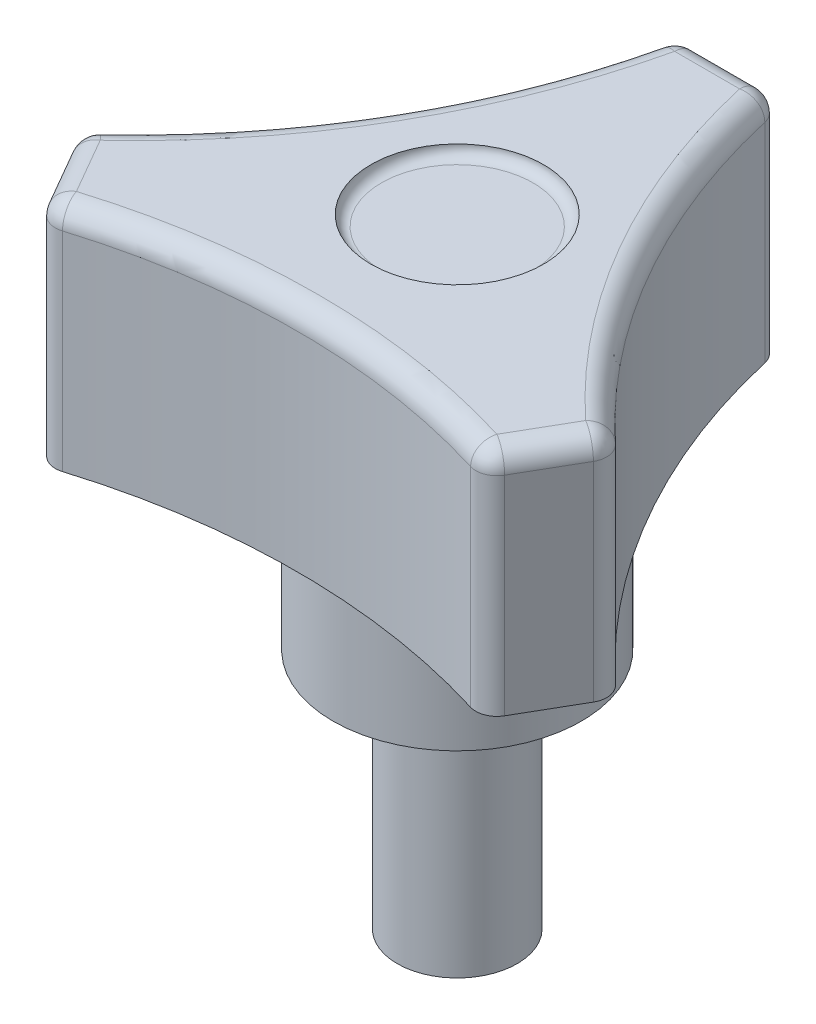
ISO-10303-21;
HEADER;
FILE_DESCRIPTION(('STEP AP214'),'2;1');
FILE_NAME('part.step','',(''),(''),'','','');
FILE_SCHEMA(('AUTOMOTIVE_DESIGN { 1 0 10303 214 1 1 1 1 }'));
ENDSEC;
DATA;
#1=APPLICATION_CONTEXT('core data for automotive mechanical design processes');
#2=APPLICATION_PROTOCOL_DEFINITION('international standard','automotive_design',2000,#1);
#3=PRODUCT_CONTEXT('',#1,'mechanical');
#4=PRODUCT('Part','Part','',(#3));
#5=PRODUCT_RELATED_PRODUCT_CATEGORY('part','',(#4));
#6=PRODUCT_DEFINITION_FORMATION('','',#4);
#7=PRODUCT_DEFINITION_CONTEXT('part definition',#1,'design');
#8=PRODUCT_DEFINITION('design','',#6,#7);
#9=PRODUCT_DEFINITION_SHAPE('','',#8);
#10=(LENGTH_UNIT() NAMED_UNIT(*) SI_UNIT(.MILLI.,.METRE.));
#11=(NAMED_UNIT(*) PLANE_ANGLE_UNIT() SI_UNIT($,.RADIAN.));
#12=(NAMED_UNIT(*) SI_UNIT($,.STERADIAN.) SOLID_ANGLE_UNIT());
#13=UNCERTAINTY_MEASURE_WITH_UNIT(LENGTH_MEASURE(1.E-05),#10,'distance_accuracy_value','');
#14=(GEOMETRIC_REPRESENTATION_CONTEXT(3) GLOBAL_UNCERTAINTY_ASSIGNED_CONTEXT((#13)) GLOBAL_UNIT_ASSIGNED_CONTEXT((#10,
#11,#12)) REPRESENTATION_CONTEXT('',''));
#15=CARTESIAN_POINT('',(0.,0.,0.));
#16=DIRECTION('',(0.,0.,1.));
#17=DIRECTION('',(1.,0.,0.));
#18=AXIS2_PLACEMENT_3D('',#15,#16,#17);
#19=CARTESIAN_POINT('',(0.,18.5,0.));
#20=DIRECTION('',(0.,-1.,0.));
#21=DIRECTION('',(0.,0.,-1.));
#22=AXIS2_PLACEMENT_3D('',#19,#20,#21);
#23=CYLINDRICAL_SURFACE('',#22,5.9);
#24=CARTESIAN_POINT('',(0.,18.5,0.));
#25=DIRECTION('',(0.,1.,0.));
#26=DIRECTION('',(0.,0.,1.));
#27=AXIS2_PLACEMENT_3D('',#24,#25,#26);
#28=CIRCLE('',#27,5.9);
#29=CARTESIAN_POINT('',(0.,18.5,5.9));
#30=VERTEX_POINT('',#29);
#31=EDGE_CURVE('E200',#30,#30,#28,.T.);
#32=ORIENTED_EDGE('',*,*,#31,.F.);
#33=EDGE_LOOP('',(#32));
#34=FACE_BOUND('',#33,.T.);
#35=CARTESIAN_POINT('',(0.,11.5,0.));
#36=DIRECTION('',(0.,1.,0.));
#37=DIRECTION('',(0.,0.,1.));
#38=AXIS2_PLACEMENT_3D('',#35,#36,#37);
#39=CIRCLE('',#38,5.9);
#40=CARTESIAN_POINT('',(0.,11.5,5.9));
#41=VERTEX_POINT('',#40);
#42=EDGE_CURVE('E199',#41,#41,#39,.T.);
#43=ORIENTED_EDGE('',*,*,#42,.T.);
#44=EDGE_LOOP('',(#43));
#45=FACE_BOUND('',#44,.T.);
#46=ADVANCED_FACE('F51',(#34,#45),#23,.T.);
#47=CARTESIAN_POINT('',(0.,11.5,0.));
#48=DIRECTION('',(0.,1.,0.));
#49=DIRECTION('',(0.,0.,1.));
#50=AXIS2_PLACEMENT_3D('',#47,#48,#49);
#51=PLANE('',#50);
#52=ORIENTED_EDGE('',*,*,#42,.F.);
#53=EDGE_LOOP('',(#52));
#54=FACE_BOUND('',#53,.T.);
#55=ADVANCED_FACE('F403',(#54),#51,.F.);
#56=CARTESIAN_POINT('',(0.,29.4,40.5683823529415));
#57=DIRECTION('',(0.,-1.,0.));
#58=DIRECTION('',(0.,0.,-1.));
#59=AXIS2_PLACEMENT_3D('',#56,#57,#58);
#60=CYLINDRICAL_SURFACE('',#59,32.9683823529415);
#61=CARTESIAN_POINT('',(0.,28.4,40.5683823529415));
#62=DIRECTION('',(0.,-1.,0.));
#63=DIRECTION('',(0.,0.,-1.));
#64=AXIS2_PLACEMENT_3D('',#61,#62,#63);
#65=CIRCLE('',#64,32.9683823529415);
#66=CARTESIAN_POINT('',(9.69329117239259,28.4,9.05720431693403));
#67=VERTEX_POINT('',#66);
#68=CARTESIAN_POINT('',(-9.69329117239258,28.4,9.05720431693404));
#69=VERTEX_POINT('',#68);
#70=EDGE_CURVE('E66',#67,#69,#65,.F.);
#71=ORIENTED_EDGE('',*,*,#70,.T.);
#72=DIRECTION('',(0.,-1.,0.));
#73=VECTOR('',#72,1.);
#74=CARTESIAN_POINT('',(-9.69329117239258,29.4,9.05720431693403));
#75=LINE('',#74,#73);
#76=CARTESIAN_POINT('',(-9.69329117239258,18.5,9.05720431693404));
#77=VERTEX_POINT('',#76);
#78=EDGE_CURVE('E59',#69,#77,#75,.T.);
#79=ORIENTED_EDGE('',*,*,#78,.T.);
#80=CARTESIAN_POINT('',(0.,18.5,40.5683823529415));
#81=DIRECTION('',(0.,-1.,0.));
#82=DIRECTION('',(0.,0.,-1.));
#83=AXIS2_PLACEMENT_3D('',#80,#81,#82);
#84=CIRCLE('',#83,32.9683823529415);
#85=CARTESIAN_POINT('',(9.69329117239259,18.5,9.05720431693403));
#86=VERTEX_POINT('',#85);
#87=EDGE_CURVE('E190',#77,#86,#84,.T.);
#88=ORIENTED_EDGE('',*,*,#87,.T.);
#89=DIRECTION('',(0.,-1.,0.));
#90=VECTOR('',#89,1.);
#91=CARTESIAN_POINT('',(9.69329117239259,29.4,9.05720431693403));
#92=LINE('',#91,#90);
#93=EDGE_CURVE('E71',#86,#67,#92,.F.);
#94=ORIENTED_EDGE('',*,*,#93,.T.);
#95=EDGE_LOOP('',(#71,#79,#88,#94));
#96=FACE_BOUND('',#95,.T.);
#97=ADVANCED_FACE('F364',(#96),#60,.F.);
#98=CARTESIAN_POINT('',(10.45,29.4,9.3));
#99=DIRECTION('',(-0.866025403784442,0.,-0.499999999999995));
#100=DIRECTION('',(-0.499999999999995,0.,0.866025403784442));
#101=AXIS2_PLACEMENT_3D('',#98,#99,#100);
#102=PLANE('',#101);
#103=DIRECTION('',(0.499999999999995,0.,-0.866025403784442));
#104=VECTOR('',#103,1.);
#105=CARTESIAN_POINT('',(10.45,18.5,9.3));
#106=LINE('',#105,#104);
#107=CARTESIAN_POINT('',(10.8533343738543,18.5,8.60140437204544));
#108=VERTEX_POINT('',#107);
#109=CARTESIAN_POINT('',(12.3966656261457,18.5,5.9282762301677));
#110=VERTEX_POINT('',#109);
#111=EDGE_CURVE('E185',#108,#110,#106,.T.);
#112=ORIENTED_EDGE('',*,*,#111,.T.);
#113=DIRECTION('',(0.,-1.,0.));
#114=VECTOR('',#113,1.);
#115=CARTESIAN_POINT('',(12.3966656261457,29.4,5.9282762301677));
#116=LINE('',#115,#114);
#117=CARTESIAN_POINT('',(12.3966656261457,28.4,5.9282762301677));
#118=VERTEX_POINT('',#117);
#119=EDGE_CURVE('E162',#110,#118,#116,.F.);
#120=ORIENTED_EDGE('',*,*,#119,.T.);
#121=DIRECTION('',(0.499999999999995,0.,-0.866025403784442));
#122=VECTOR('',#121,1.);
#123=CARTESIAN_POINT('',(10.45,28.4,9.3));
#124=LINE('',#123,#122);
#125=CARTESIAN_POINT('',(10.8533343738543,28.4,8.60140437204544));
#126=VERTEX_POINT('',#125);
#127=EDGE_CURVE('E167',#118,#126,#124,.F.);
#128=ORIENTED_EDGE('',*,*,#127,.T.);
#129=DIRECTION('',(0.,-1.,0.));
#130=VECTOR('',#129,1.);
#131=CARTESIAN_POINT('',(10.8533343738543,29.4,8.60140437204544));
#132=LINE('',#131,#130);
#133=EDGE_CURVE('E216',#126,#108,#132,.T.);
#134=ORIENTED_EDGE('',*,*,#133,.T.);
#135=EDGE_LOOP('',(#112,#120,#128,#134));
#136=FACE_BOUND('',#135,.T.);
#137=ADVANCED_FACE('F344',(#136),#102,.F.);
#138=CARTESIAN_POINT('',(34.6542134528919,29.4,-19.4544760438048));
#139=DIRECTION('',(0.,-1.,0.));
#140=DIRECTION('',(0.,0.,-1.));
#141=AXIS2_PLACEMENT_3D('',#138,#139,#140);
#142=CYLINDRICAL_SURFACE('',#141,32.9683823529411);
#143=CARTESIAN_POINT('',(34.6542134528919,28.4,-19.4544760438048));
#144=DIRECTION('',(0.,-1.,0.));
#145=DIRECTION('',(0.,0.,-1.));
#146=AXIS2_PLACEMENT_3D('',#143,#144,#145);
#147=CIRCLE('',#146,32.9683823529411);
#148=CARTESIAN_POINT('',(2.51808718433934,28.4,-12.0935234273726));
#149=VERTEX_POINT('',#148);
#150=CARTESIAN_POINT('',(12.2113783567319,28.4,4.69574937577017));
#151=VERTEX_POINT('',#150);
#152=EDGE_CURVE('E176',#149,#151,#147,.F.);
#153=ORIENTED_EDGE('',*,*,#152,.T.);
#154=DIRECTION('',(0.,-1.,0.));
#155=VECTOR('',#154,1.);
#156=CARTESIAN_POINT('',(12.2113783567319,29.4,4.69574937577017));
#157=LINE('',#156,#155);
#158=CARTESIAN_POINT('',(12.2113783567319,18.5,4.69574937577017));
#159=VERTEX_POINT('',#158);
#160=EDGE_CURVE('E161',#151,#159,#157,.T.);
#161=ORIENTED_EDGE('',*,*,#160,.T.);
#162=CARTESIAN_POINT('',(34.6542134528919,18.5,-19.4544760438048));
#163=DIRECTION('',(0.,-1.,0.));
#164=DIRECTION('',(0.,0.,-1.));
#165=AXIS2_PLACEMENT_3D('',#162,#163,#164);
#166=CIRCLE('',#165,32.9683823529411);
#167=CARTESIAN_POINT('',(2.51808718433934,18.5,-12.0935234273726));
#168=VERTEX_POINT('',#167);
#169=EDGE_CURVE('E173',#159,#168,#166,.T.);
#170=ORIENTED_EDGE('',*,*,#169,.T.);
#171=DIRECTION('',(0.,-1.,0.));
#172=VECTOR('',#171,1.);
#173=CARTESIAN_POINT('',(2.51808718433934,29.4,-12.0935234273726));
#174=LINE('',#173,#172);
#175=EDGE_CURVE('E179',#168,#149,#174,.F.);
#176=ORIENTED_EDGE('',*,*,#175,.T.);
#177=EDGE_LOOP('',(#153,#161,#170,#176));
#178=FACE_BOUND('',#177,.T.);
#179=ADVANCED_FACE('F172',(#178),#142,.F.);
#180=CARTESIAN_POINT('',(-2.34999999999991,29.4,-12.8702503368815));
#181=DIRECTION('',(0.,0.,1.));
#182=DIRECTION('',(1.,0.,0.));
#183=AXIS2_PLACEMENT_3D('',#180,#181,#182);
#184=PLANE('',#183);
#185=DIRECTION('',(-1.,0.,0.));
#186=VECTOR('',#185,1.);
#187=CARTESIAN_POINT('',(-2.34999999999991,28.4,-12.8702503368815));
#188=LINE('',#187,#186);
#189=CARTESIAN_POINT('',(-1.5433312522914,28.4,-12.8702503368815));
#190=VERTEX_POINT('',#189);
#191=CARTESIAN_POINT('',(1.54333125229144,28.4,-12.8702503368815));
#192=VERTEX_POINT('',#191);
#193=EDGE_CURVE('E221',#190,#192,#188,.F.);
#194=ORIENTED_EDGE('',*,*,#193,.T.);
#195=DIRECTION('',(0.,-1.,0.));
#196=VECTOR('',#195,1.);
#197=CARTESIAN_POINT('',(1.54333125229144,29.4,-12.8702503368815));
#198=LINE('',#197,#196);
#199=CARTESIAN_POINT('',(1.54333125229144,18.5,-12.8702503368815));
#200=VERTEX_POINT('',#199);
#201=EDGE_CURVE('E223',#192,#200,#198,.T.);
#202=ORIENTED_EDGE('',*,*,#201,.T.);
#203=DIRECTION('',(-1.,0.,0.));
#204=VECTOR('',#203,1.);
#205=CARTESIAN_POINT('',(-2.34999999999991,18.5,-12.8702503368815));
#206=LINE('',#205,#204);
#207=CARTESIAN_POINT('',(-1.5433312522914,18.5,-12.8702503368815));
#208=VERTEX_POINT('',#207);
#209=EDGE_CURVE('E184',#200,#208,#206,.T.);
#210=ORIENTED_EDGE('',*,*,#209,.T.);
#211=DIRECTION('',(0.,-1.,0.));
#212=VECTOR('',#211,1.);
#213=CARTESIAN_POINT('',(-1.5433312522914,29.4,-12.8702503368815));
#214=LINE('',#213,#212);
#215=EDGE_CURVE('E219',#208,#190,#214,.F.);
#216=ORIENTED_EDGE('',*,*,#215,.T.);
#217=EDGE_LOOP('',(#194,#202,#210,#216));
#218=FACE_BOUND('',#217,.T.);
#219=ADVANCED_FACE('F391',(#218),#184,.F.);
#220=CARTESIAN_POINT('',(-34.654213452892,29.4,-19.4544760438046));
#221=DIRECTION('',(0.,-1.,0.));
#222=DIRECTION('',(0.,0.,-1.));
#223=AXIS2_PLACEMENT_3D('',#220,#221,#222);
#224=CYLINDRICAL_SURFACE('',#223,32.9683823529411);
#225=CARTESIAN_POINT('',(-34.654213452892,28.4,-19.4544760438046));
#226=DIRECTION('',(0.,-1.,0.));
#227=DIRECTION('',(0.,0.,-1.));
#228=AXIS2_PLACEMENT_3D('',#225,#226,#227);
#229=CIRCLE('',#228,32.9683823529411);
#230=CARTESIAN_POINT('',(-12.2113783567319,28.4,4.6957493757703));
#231=VERTEX_POINT('',#230);
#232=CARTESIAN_POINT('',(-2.51808718433929,28.4,-12.0935234273726));
#233=VERTEX_POINT('',#232);
#234=EDGE_CURVE('E238',#231,#233,#229,.F.);
#235=ORIENTED_EDGE('',*,*,#234,.T.);
#236=DIRECTION('',(0.,-1.,0.));
#237=VECTOR('',#236,1.);
#238=CARTESIAN_POINT('',(-2.5180871843393,29.4,-12.0935234273726));
#239=LINE('',#238,#237);
#240=CARTESIAN_POINT('',(-2.5180871843393,18.5,-12.0935234273726));
#241=VERTEX_POINT('',#240);
#242=EDGE_CURVE('E242',#233,#241,#239,.T.);
#243=ORIENTED_EDGE('',*,*,#242,.T.);
#244=CARTESIAN_POINT('',(-34.654213452892,18.5,-19.4544760438046));
#245=DIRECTION('',(0.,-1.,0.));
#246=DIRECTION('',(0.,0.,-1.));
#247=AXIS2_PLACEMENT_3D('',#244,#245,#246);
#248=CIRCLE('',#247,32.9683823529411);
#249=CARTESIAN_POINT('',(-12.2113783567319,18.5,4.6957493757703));
#250=VERTEX_POINT('',#249);
#251=EDGE_CURVE('E188',#241,#250,#248,.T.);
#252=ORIENTED_EDGE('',*,*,#251,.T.);
#253=DIRECTION('',(0.,-1.,0.));
#254=VECTOR('',#253,1.);
#255=CARTESIAN_POINT('',(-12.2113783567319,29.4,4.6957493757703));
#256=LINE('',#255,#254);
#257=EDGE_CURVE('E240',#250,#231,#256,.F.);
#258=ORIENTED_EDGE('',*,*,#257,.T.);
#259=EDGE_LOOP('',(#235,#243,#252,#258));
#260=FACE_BOUND('',#259,.T.);
#261=ADVANCED_FACE('F376',(#260),#224,.F.);
#262=CARTESIAN_POINT('',(-10.45,29.4,9.3));
#263=DIRECTION('',(0.866025403784443,0.,-0.499999999999993));
#264=DIRECTION('',(-0.499999999999993,0.,-0.866025403784443));
#265=AXIS2_PLACEMENT_3D('',#262,#263,#264);
#266=PLANE('',#265);
#267=DIRECTION('',(0.499999999999993,0.,0.866025403784443));
#268=VECTOR('',#267,1.);
#269=CARTESIAN_POINT('',(-10.45,28.4,9.3));
#270=LINE('',#269,#268);
#271=CARTESIAN_POINT('',(-10.8533343738542,28.4,8.60140437204545));
#272=VERTEX_POINT('',#271);
#273=CARTESIAN_POINT('',(-12.3966656261456,28.4,5.92827623016782));
#274=VERTEX_POINT('',#273);
#275=EDGE_CURVE('E244',#272,#274,#270,.F.);
#276=ORIENTED_EDGE('',*,*,#275,.T.);
#277=DIRECTION('',(0.,-1.,0.));
#278=VECTOR('',#277,1.);
#279=CARTESIAN_POINT('',(-12.3966656261456,29.4,5.92827623016782));
#280=LINE('',#279,#278);
#281=CARTESIAN_POINT('',(-12.3966656261456,18.5,5.92827623016782));
#282=VERTEX_POINT('',#281);
#283=EDGE_CURVE('E248',#274,#282,#280,.T.);
#284=ORIENTED_EDGE('',*,*,#283,.T.);
#285=DIRECTION('',(0.499999999999993,0.,0.866025403784443));
#286=VECTOR('',#285,1.);
#287=CARTESIAN_POINT('',(-10.45,18.5,9.3));
#288=LINE('',#287,#286);
#289=CARTESIAN_POINT('',(-10.8533343738542,18.5,8.60140437204545));
#290=VERTEX_POINT('',#289);
#291=EDGE_CURVE('E196',#282,#290,#288,.T.);
#292=ORIENTED_EDGE('',*,*,#291,.T.);
#293=DIRECTION('',(0.,-1.,0.));
#294=VECTOR('',#293,1.);
#295=CARTESIAN_POINT('',(-10.8533343738542,29.4,8.60140437204545));
#296=LINE('',#295,#294);
#297=EDGE_CURVE('E246',#290,#272,#296,.F.);
#298=ORIENTED_EDGE('',*,*,#297,.T.);
#299=EDGE_LOOP('',(#276,#284,#292,#298));
#300=FACE_BOUND('',#299,.T.);
#301=ADVANCED_FACE('F318',(#300),#266,.F.);
#302=CARTESIAN_POINT('',(0.,29.4,40.5683823529415));
#303=DIRECTION('',(0.,-1.,0.));
#304=DIRECTION('',(0.,0.,-1.));
#305=AXIS2_PLACEMENT_3D('',#302,#303,#304);
#306=PLANE('',#305);
#307=CARTESIAN_POINT('',(0.,29.4,0.));
#308=DIRECTION('',(0.,1.,0.));
#309=DIRECTION('',(0.,0.,1.));
#310=AXIS2_PLACEMENT_3D('',#307,#308,#309);
#311=CIRCLE('',#310,4.1);
#312=CARTESIAN_POINT('',(0.,29.4,4.1));
#313=VERTEX_POINT('',#312);
#314=EDGE_CURVE('E256',#313,#313,#311,.T.);
#315=ORIENTED_EDGE('',*,*,#314,.F.);
#316=EDGE_LOOP('',(#315));
#317=FACE_BOUND('',#316,.T.);
#318=CARTESIAN_POINT('',(34.6542134528919,29.4,-19.4544760438048));
#319=DIRECTION('',(0.,-1.,0.));
#320=DIRECTION('',(0.,0.,-1.));
#321=AXIS2_PLACEMENT_3D('',#318,#319,#320);
#322=CIRCLE('',#321,33.9683823529411);
#323=CARTESIAN_POINT('',(11.5306402223613,29.4,5.42827623016771));
#324=VERTEX_POINT('',#323);
#325=CARTESIAN_POINT('',(1.54333125229145,29.4,-11.8702503368815));
#326=VERTEX_POINT('',#325);
#327=EDGE_CURVE('E231',#324,#326,#322,.T.);
#328=ORIENTED_EDGE('',*,*,#327,.T.);
#329=DIRECTION('',(-1.,0.,0.));
#330=VECTOR('',#329,1.);
#331=CARTESIAN_POINT('',(0.,29.4,-11.8702503368815));
#332=LINE('',#331,#330);
#333=CARTESIAN_POINT('',(-1.5433312522914,29.4,-11.8702503368815));
#334=VERTEX_POINT('',#333);
#335=EDGE_CURVE('E235',#326,#334,#332,.T.);
#336=ORIENTED_EDGE('',*,*,#335,.T.);
#337=CARTESIAN_POINT('',(-34.654213452892,29.4,-19.4544760438046));
#338=DIRECTION('',(0.,-1.,0.));
#339=DIRECTION('',(0.,0.,-1.));
#340=AXIS2_PLACEMENT_3D('',#337,#338,#339);
#341=CIRCLE('',#340,33.9683823529411);
#342=CARTESIAN_POINT('',(-11.5306402223612,29.4,5.42827623016783));
#343=VERTEX_POINT('',#342);
#344=EDGE_CURVE('E233',#334,#343,#341,.T.);
#345=ORIENTED_EDGE('',*,*,#344,.T.);
#346=DIRECTION('',(0.499999999999993,0.,0.866025403784443));
#347=VECTOR('',#346,1.);
#348=CARTESIAN_POINT('',(6.56813213023045,29.4,36.77626949948));
#349=LINE('',#348,#347);
#350=CARTESIAN_POINT('',(-9.9873089700698,29.4,8.10140437204545));
#351=VERTEX_POINT('',#350);
#352=EDGE_CURVE('E229',#343,#351,#349,.T.);
#353=ORIENTED_EDGE('',*,*,#352,.T.);
#354=CARTESIAN_POINT('',(0.,29.4,40.5683823529415));
#355=DIRECTION('',(0.,-1.,0.));
#356=DIRECTION('',(0.,0.,-1.));
#357=AXIS2_PLACEMENT_3D('',#354,#355,#356);
#358=CIRCLE('',#357,33.9683823529415);
#359=CARTESIAN_POINT('',(9.98730897006981,29.4,8.10140437204544));
#360=VERTEX_POINT('',#359);
#361=EDGE_CURVE('E225',#351,#360,#358,.T.);
#362=ORIENTED_EDGE('',*,*,#361,.T.);
#363=DIRECTION('',(0.499999999999995,0.,-0.866025403784442));
#364=VECTOR('',#363,1.);
#365=CARTESIAN_POINT('',(-6.56813213023049,29.4,36.77626949948));
#366=LINE('',#365,#364);
#367=EDGE_CURVE('E227',#360,#324,#366,.T.);
#368=ORIENTED_EDGE('',*,*,#367,.T.);
#369=EDGE_LOOP('',(#328,#336,#345,#353,#362,#368));
#370=FACE_BOUND('',#369,.T.);
#371=ADVANCED_FACE('F315',(#317,#370),#306,.F.);
#372=CARTESIAN_POINT('',(0.,18.5,40.5683823529415));
#373=DIRECTION('',(0.,-1.,0.));
#374=DIRECTION('',(0.,0.,-1.));
#375=AXIS2_PLACEMENT_3D('',#372,#373,#374);
#376=PLANE('',#375);
#377=ORIENTED_EDGE('',*,*,#31,.T.);
#378=EDGE_LOOP('',(#377));
#379=FACE_BOUND('',#378,.T.);
#380=ORIENTED_EDGE('',*,*,#169,.F.);
#381=CARTESIAN_POINT('',(11.5306402223613,18.5,5.42827623016771));
#382=DIRECTION('',(0.,-1.,0.));
#383=DIRECTION('',(0.,0.,-1.));
#384=AXIS2_PLACEMENT_3D('',#381,#382,#383);
#385=CIRCLE('',#384,1.);
#386=EDGE_CURVE('E157',#159,#110,#385,.T.);
#387=ORIENTED_EDGE('',*,*,#386,.T.);
#388=ORIENTED_EDGE('',*,*,#111,.F.);
#389=CARTESIAN_POINT('',(9.98730897006981,18.5,8.10140437204545));
#390=DIRECTION('',(0.,-1.,0.));
#391=DIRECTION('',(0.,0.,-1.));
#392=AXIS2_PLACEMENT_3D('',#389,#390,#391);
#393=CIRCLE('',#392,1.);
#394=EDGE_CURVE('E178',#108,#86,#393,.T.);
#395=ORIENTED_EDGE('',*,*,#394,.T.);
#396=ORIENTED_EDGE('',*,*,#87,.F.);
#397=CARTESIAN_POINT('',(-9.9873089700698,18.5,8.10140437204545));
#398=DIRECTION('',(0.,-1.,0.));
#399=DIRECTION('',(0.,0.,-1.));
#400=AXIS2_PLACEMENT_3D('',#397,#398,#399);
#401=CIRCLE('',#400,1.);
#402=EDGE_CURVE('E208',#77,#290,#401,.T.);
#403=ORIENTED_EDGE('',*,*,#402,.T.);
#404=ORIENTED_EDGE('',*,*,#291,.F.);
#405=CARTESIAN_POINT('',(-11.5306402223612,18.5,5.42827623016783));
#406=DIRECTION('',(0.,-1.,0.));
#407=DIRECTION('',(0.,0.,-1.));
#408=AXIS2_PLACEMENT_3D('',#405,#406,#407);
#409=CIRCLE('',#408,1.);
#410=EDGE_CURVE('E210',#282,#250,#409,.T.);
#411=ORIENTED_EDGE('',*,*,#410,.T.);
#412=ORIENTED_EDGE('',*,*,#251,.F.);
#413=CARTESIAN_POINT('',(-1.5433312522914,18.5,-11.8702503368815));
#414=DIRECTION('',(0.,-1.,0.));
#415=DIRECTION('',(0.,0.,-1.));
#416=AXIS2_PLACEMENT_3D('',#413,#414,#415);
#417=CIRCLE('',#416,1.);
#418=EDGE_CURVE('E212',#241,#208,#417,.T.);
#419=ORIENTED_EDGE('',*,*,#418,.T.);
#420=ORIENTED_EDGE('',*,*,#209,.F.);
#421=CARTESIAN_POINT('',(1.54333125229144,18.5,-11.8702503368815));
#422=DIRECTION('',(0.,-1.,0.));
#423=DIRECTION('',(0.,0.,-1.));
#424=AXIS2_PLACEMENT_3D('',#421,#422,#423);
#425=CIRCLE('',#424,1.);
#426=EDGE_CURVE('E168',#200,#168,#425,.T.);
#427=ORIENTED_EDGE('',*,*,#426,.T.);
#428=EDGE_LOOP('',(#380,#387,#388,#395,#396,#403,#404,#411,#412,#419,#420,#427));
#429=FACE_BOUND('',#428,.T.);
#430=ADVANCED_FACE('F181',(#379,#429),#376,.T.);
#431=CARTESIAN_POINT('',(-11.5306402223612,29.4,5.42827623016783));
#432=DIRECTION('',(0.,-1.,0.));
#433=DIRECTION('',(0.,0.,-1.));
#434=AXIS2_PLACEMENT_3D('',#431,#432,#433);
#435=CYLINDRICAL_SURFACE('',#434,1.);
#436=CARTESIAN_POINT('',(-11.5306402223612,28.4,5.42827623016783));
#437=DIRECTION('',(0.,1.,0.));
#438=DIRECTION('',(0.,0.,1.));
#439=AXIS2_PLACEMENT_3D('',#436,#437,#438);
#440=CIRCLE('',#439,1.);
#441=EDGE_CURVE('E302',#231,#274,#440,.T.);
#442=ORIENTED_EDGE('',*,*,#441,.F.);
#443=ORIENTED_EDGE('',*,*,#257,.F.);
#444=ORIENTED_EDGE('',*,*,#410,.F.);
#445=ORIENTED_EDGE('',*,*,#283,.F.);
#446=EDGE_LOOP('',(#442,#443,#444,#445));
#447=FACE_BOUND('',#446,.T.);
#448=ADVANCED_FACE('F371',(#447),#435,.T.);
#449=CARTESIAN_POINT('',(-11.5306402223612,28.4,5.42827623016783));
#450=DIRECTION('',(0.,1.,0.));
#451=DIRECTION('',(-1.,0.,0.));
#452=AXIS2_PLACEMENT_3D('',#449,#450,#451);
#453=SPHERICAL_SURFACE('',#452,1.);
#454=CARTESIAN_POINT('',(-11.5306402223612,28.4,5.42827623016783));
#455=DIRECTION('',(-0.732526854397525,0.,0.680738134370675));
#456=DIRECTION('',(0.680738134370675,0.,0.732526854397525));
#457=AXIS2_PLACEMENT_3D('',#454,#455,#456);
#458=CIRCLE('',#457,1.);
#459=EDGE_CURVE('E297',#231,#343,#458,.F.);
#460=ORIENTED_EDGE('',*,*,#459,.F.);
#461=ORIENTED_EDGE('',*,*,#441,.T.);
#462=CARTESIAN_POINT('',(-11.5306402223612,28.4,5.42827623016783));
#463=DIRECTION('',(-0.499999999999993,0.,-0.866025403784443));
#464=DIRECTION('',(-0.866025403784443,0.,0.499999999999993));
#465=AXIS2_PLACEMENT_3D('',#462,#463,#464);
#466=CIRCLE('',#465,1.);
#467=EDGE_CURVE('E300',#343,#274,#466,.F.);
#468=ORIENTED_EDGE('',*,*,#467,.F.);
#469=EDGE_LOOP('',(#460,#461,#468));
#470=FACE_BOUND('',#469,.T.);
#471=ADVANCED_FACE('F579',(#470),#453,.T.);
#472=CARTESIAN_POINT('',(-9.9873089700698,29.4,8.10140437204545));
#473=DIRECTION('',(0.,-1.,0.));
#474=DIRECTION('',(0.,0.,-1.));
#475=AXIS2_PLACEMENT_3D('',#472,#473,#474);
#476=CYLINDRICAL_SURFACE('',#475,1.);
#477=ORIENTED_EDGE('',*,*,#402,.F.);
#478=ORIENTED_EDGE('',*,*,#78,.F.);
#479=CARTESIAN_POINT('',(-9.9873089700698,28.4,8.10140437204545));
#480=DIRECTION('',(0.,1.,0.));
#481=DIRECTION('',(0.,0.,1.));
#482=AXIS2_PLACEMENT_3D('',#479,#480,#481);
#483=CIRCLE('',#482,1.);
#484=EDGE_CURVE('E294',#272,#69,#483,.T.);
#485=ORIENTED_EDGE('',*,*,#484,.F.);
#486=ORIENTED_EDGE('',*,*,#297,.F.);
#487=EDGE_LOOP('',(#477,#478,#485,#486));
#488=FACE_BOUND('',#487,.T.);
#489=ADVANCED_FACE('F363',(#488),#476,.T.);
#490=CARTESIAN_POINT('',(6.56813213023045,28.4,36.77626949948));
#491=DIRECTION('',(0.499999999999993,0.,0.866025403784443));
#492=DIRECTION('',(0.866025403784443,0.,-0.499999999999993));
#493=AXIS2_PLACEMENT_3D('',#490,#491,#492);
#494=CYLINDRICAL_SURFACE('',#493,1.);
#495=ORIENTED_EDGE('',*,*,#467,.T.);
#496=ORIENTED_EDGE('',*,*,#275,.F.);
#497=CARTESIAN_POINT('',(-9.9873089700698,28.4,8.10140437204545));
#498=DIRECTION('',(0.499999999999998,0.,0.86602540378444));
#499=DIRECTION('',(0.86602540378444,0.,-0.499999999999998));
#500=AXIS2_PLACEMENT_3D('',#497,#498,#499);
#501=CIRCLE('',#500,1.);
#502=EDGE_CURVE('E291',#351,#272,#501,.T.);
#503=ORIENTED_EDGE('',*,*,#502,.F.);
#504=ORIENTED_EDGE('',*,*,#352,.F.);
#505=EDGE_LOOP('',(#495,#496,#503,#504));
#506=FACE_BOUND('',#505,.T.);
#507=ADVANCED_FACE('F559',(#506),#494,.T.);
#508=CARTESIAN_POINT('',(-34.654213452892,28.4,-19.4544760438046));
#509=DIRECTION('',(0.,-1.,0.));
#510=DIRECTION('',(0.,0.,-1.));
#511=AXIS2_PLACEMENT_3D('',#508,#509,#510);
#512=TOROIDAL_SURFACE('',#511,33.9683823529411,1.);
#513=ORIENTED_EDGE('',*,*,#459,.T.);
#514=ORIENTED_EDGE('',*,*,#344,.F.);
#515=CARTESIAN_POINT('',(-1.54333125229139,28.4,-11.8702503368815));
#516=DIRECTION('',(0.22327309049106,0.,-0.9747559320479));
#517=DIRECTION('',(-0.9747559320479,0.,-0.22327309049106));
#518=AXIS2_PLACEMENT_3D('',#515,#516,#517);
#519=CIRCLE('',#518,1.);
#520=EDGE_CURVE('E288',#233,#334,#519,.T.);
#521=ORIENTED_EDGE('',*,*,#520,.F.);
#522=ORIENTED_EDGE('',*,*,#234,.F.);
#523=EDGE_LOOP('',(#513,#514,#521,#522));
#524=FACE_BOUND('',#523,.T.);
#525=ADVANCED_FACE('F386',(#524),#512,.T.);
#526=CARTESIAN_POINT('',(-1.5433312522914,29.4,-11.8702503368815));
#527=DIRECTION('',(0.,-1.,0.));
#528=DIRECTION('',(0.,0.,-1.));
#529=AXIS2_PLACEMENT_3D('',#526,#527,#528);
#530=CYLINDRICAL_SURFACE('',#529,1.);
#531=ORIENTED_EDGE('',*,*,#418,.F.);
#532=ORIENTED_EDGE('',*,*,#242,.F.);
#533=CARTESIAN_POINT('',(-1.5433312522914,28.4,-11.8702503368815));
#534=DIRECTION('',(0.,1.,0.));
#535=DIRECTION('',(0.,0.,1.));
#536=AXIS2_PLACEMENT_3D('',#533,#534,#535);
#537=CIRCLE('',#536,1.);
#538=EDGE_CURVE('E285',#190,#233,#537,.T.);
#539=ORIENTED_EDGE('',*,*,#538,.F.);
#540=ORIENTED_EDGE('',*,*,#215,.F.);
#541=EDGE_LOOP('',(#531,#532,#539,#540));
#542=FACE_BOUND('',#541,.T.);
#543=ADVANCED_FACE('F382',(#542),#530,.T.);
#544=CARTESIAN_POINT('',(-9.98730897006981,28.4,8.10140437204545));
#545=DIRECTION('',(0.,1.,0.));
#546=DIRECTION('',(-1.,0.,0.));
#547=AXIS2_PLACEMENT_3D('',#544,#545,#546);
#548=SPHERICAL_SURFACE('',#547,1.);
#549=ORIENTED_EDGE('',*,*,#502,.T.);
#550=ORIENTED_EDGE('',*,*,#484,.T.);
#551=CARTESIAN_POINT('',(-9.9873089700698,28.4,8.10140437204545));
#552=DIRECTION('',(-0.955799944888591,0.,0.294017797677225));
#553=DIRECTION('',(0.294017797677225,0.,0.955799944888591));
#554=AXIS2_PLACEMENT_3D('',#551,#552,#553);
#555=CIRCLE('',#554,1.);
#556=EDGE_CURVE('E282',#351,#69,#555,.F.);
#557=ORIENTED_EDGE('',*,*,#556,.F.);
#558=EDGE_LOOP('',(#549,#550,#557));
#559=FACE_BOUND('',#558,.T.);
#560=ADVANCED_FACE('F357',(#559),#548,.T.);
#561=CARTESIAN_POINT('',(-1.54333125229139,28.4,-11.8702503368815));
#562=DIRECTION('',(0.,1.,0.));
#563=DIRECTION('',(-1.,0.,0.));
#564=AXIS2_PLACEMENT_3D('',#561,#562,#563);
#565=SPHERICAL_SURFACE('',#564,1.);
#566=ORIENTED_EDGE('',*,*,#538,.T.);
#567=ORIENTED_EDGE('',*,*,#520,.T.);
#568=CARTESIAN_POINT('',(-1.5433312522914,28.4,-11.8702503368815));
#569=DIRECTION('',(-1.,0.,0.));
#570=DIRECTION('',(0.,0.,1.));
#571=AXIS2_PLACEMENT_3D('',#568,#569,#570);
#572=CIRCLE('',#571,1.);
#573=EDGE_CURVE('E280',#190,#334,#572,.F.);
#574=ORIENTED_EDGE('',*,*,#573,.F.);
#575=EDGE_LOOP('',(#566,#567,#574));
#576=FACE_BOUND('',#575,.T.);
#577=ADVANCED_FACE('F388',(#576),#565,.T.);
#578=CARTESIAN_POINT('',(9.98730897006981,29.4,8.10140437204545));
#579=DIRECTION('',(0.,-1.,0.));
#580=DIRECTION('',(0.,0.,-1.));
#581=AXIS2_PLACEMENT_3D('',#578,#579,#580);
#582=CYLINDRICAL_SURFACE('',#581,1.);
#583=ORIENTED_EDGE('',*,*,#394,.F.);
#584=ORIENTED_EDGE('',*,*,#133,.F.);
#585=CARTESIAN_POINT('',(9.98730897006981,28.4,8.10140437204544));
#586=DIRECTION('',(0.,1.,0.));
#587=DIRECTION('',(0.,0.,1.));
#588=AXIS2_PLACEMENT_3D('',#585,#586,#587);
#589=CIRCLE('',#588,1.);
#590=EDGE_CURVE('E277',#67,#126,#589,.T.);
#591=ORIENTED_EDGE('',*,*,#590,.F.);
#592=ORIENTED_EDGE('',*,*,#93,.F.);
#593=EDGE_LOOP('',(#583,#584,#591,#592));
#594=FACE_BOUND('',#593,.T.);
#595=ADVANCED_FACE('F348',(#594),#582,.T.);
#596=CARTESIAN_POINT('',(0.,28.4,40.5683823529415));
#597=DIRECTION('',(0.,-1.,0.));
#598=DIRECTION('',(0.,0.,-1.));
#599=AXIS2_PLACEMENT_3D('',#596,#597,#598);
#600=TOROIDAL_SURFACE('',#599,33.9683823529415,1.);
#601=ORIENTED_EDGE('',*,*,#556,.T.);
#602=ORIENTED_EDGE('',*,*,#70,.F.);
#603=CARTESIAN_POINT('',(9.98730897006981,28.4,8.10140437204544));
#604=DIRECTION('',(0.955799944888592,0.,0.294017797677223));
#605=DIRECTION('',(0.294017797677223,0.,-0.955799944888592));
#606=AXIS2_PLACEMENT_3D('',#603,#604,#605);
#607=CIRCLE('',#606,1.);
#608=EDGE_CURVE('E274',#360,#67,#607,.T.);
#609=ORIENTED_EDGE('',*,*,#608,.F.);
#610=ORIENTED_EDGE('',*,*,#361,.F.);
#611=EDGE_LOOP('',(#601,#602,#609,#610));
#612=FACE_BOUND('',#611,.T.);
#613=ADVANCED_FACE('F354',(#612),#600,.T.);
#614=CARTESIAN_POINT('',(0.,28.4,-11.8702503368815));
#615=DIRECTION('',(-1.,0.,0.));
#616=DIRECTION('',(0.,0.,1.));
#617=AXIS2_PLACEMENT_3D('',#614,#615,#616);
#618=CYLINDRICAL_SURFACE('',#617,1.);
#619=ORIENTED_EDGE('',*,*,#573,.T.);
#620=ORIENTED_EDGE('',*,*,#335,.F.);
#621=CARTESIAN_POINT('',(1.54333125229144,28.4,-11.8702503368815));
#622=DIRECTION('',(1.,0.,0.));
#623=DIRECTION('',(0.,1.,0.));
#624=AXIS2_PLACEMENT_3D('',#621,#622,#623);
#625=CIRCLE('',#624,1.);
#626=EDGE_CURVE('E271',#192,#326,#625,.T.);
#627=ORIENTED_EDGE('',*,*,#626,.F.);
#628=ORIENTED_EDGE('',*,*,#193,.F.);
#629=EDGE_LOOP('',(#619,#620,#627,#628));
#630=FACE_BOUND('',#629,.T.);
#631=ADVANCED_FACE('F327',(#630),#618,.T.);
#632=CARTESIAN_POINT('',(1.54333125229144,29.4,-11.8702503368815));
#633=DIRECTION('',(0.,-1.,0.));
#634=DIRECTION('',(0.,0.,-1.));
#635=AXIS2_PLACEMENT_3D('',#632,#633,#634);
#636=CYLINDRICAL_SURFACE('',#635,1.);
#637=ORIENTED_EDGE('',*,*,#426,.F.);
#638=ORIENTED_EDGE('',*,*,#201,.F.);
#639=CARTESIAN_POINT('',(1.54333125229144,28.4,-11.8702503368815));
#640=DIRECTION('',(0.,1.,0.));
#641=DIRECTION('',(0.,0.,1.));
#642=AXIS2_PLACEMENT_3D('',#639,#640,#641);
#643=CIRCLE('',#642,1.);
#644=EDGE_CURVE('E268',#149,#192,#643,.T.);
#645=ORIENTED_EDGE('',*,*,#644,.F.);
#646=ORIENTED_EDGE('',*,*,#175,.F.);
#647=EDGE_LOOP('',(#637,#638,#645,#646));
#648=FACE_BOUND('',#647,.T.);
#649=ADVANCED_FACE('F393',(#648),#636,.T.);
#650=CARTESIAN_POINT('',(9.98730897006981,28.4,8.10140437204544));
#651=DIRECTION('',(0.,1.,0.));
#652=DIRECTION('',(-1.,0.,0.));
#653=AXIS2_PLACEMENT_3D('',#650,#651,#652);
#654=SPHERICAL_SURFACE('',#653,1.);
#655=ORIENTED_EDGE('',*,*,#608,.T.);
#656=ORIENTED_EDGE('',*,*,#590,.T.);
#657=CARTESIAN_POINT('',(9.98730897006981,28.4,8.10140437204544));
#658=DIRECTION('',(-0.499999999999995,0.,0.866025403784441));
#659=DIRECTION('',(0.866025403784441,0.,0.499999999999995));
#660=AXIS2_PLACEMENT_3D('',#657,#658,#659);
#661=CIRCLE('',#660,1.);
#662=EDGE_CURVE('E265',#360,#126,#661,.F.);
#663=ORIENTED_EDGE('',*,*,#662,.F.);
#664=EDGE_LOOP('',(#655,#656,#663));
#665=FACE_BOUND('',#664,.T.);
#666=ADVANCED_FACE('F350',(#665),#654,.T.);
#667=CARTESIAN_POINT('',(1.54333125229144,28.4,-11.8702503368815));
#668=DIRECTION('',(0.,1.,0.));
#669=DIRECTION('',(0.,0.,1.));
#670=AXIS2_PLACEMENT_3D('',#667,#668,#669);
#671=SPHERICAL_SURFACE('',#670,1.);
#672=ORIENTED_EDGE('',*,*,#644,.T.);
#673=ORIENTED_EDGE('',*,*,#626,.T.);
#674=CARTESIAN_POINT('',(1.54333125229145,28.4,-11.8702503368815));
#675=DIRECTION('',(-0.223273090491061,0.,-0.9747559320479));
#676=DIRECTION('',(-0.9747559320479,0.,0.223273090491061));
#677=AXIS2_PLACEMENT_3D('',#674,#675,#676);
#678=CIRCLE('',#677,1.);
#679=EDGE_CURVE('E262',#149,#326,#678,.F.);
#680=ORIENTED_EDGE('',*,*,#679,.F.);
#681=EDGE_LOOP('',(#672,#673,#680));
#682=FACE_BOUND('',#681,.T.);
#683=ADVANCED_FACE('F332',(#682),#671,.T.);
#684=CARTESIAN_POINT('',(-6.56813213023049,28.4,36.77626949948));
#685=DIRECTION('',(0.499999999999995,0.,-0.866025403784442));
#686=DIRECTION('',(-0.866025403784442,0.,-0.499999999999995));
#687=AXIS2_PLACEMENT_3D('',#684,#685,#686);
#688=CYLINDRICAL_SURFACE('',#687,1.);
#689=ORIENTED_EDGE('',*,*,#662,.T.);
#690=ORIENTED_EDGE('',*,*,#127,.F.);
#691=CARTESIAN_POINT('',(11.5306402223613,28.4,5.42827623016771));
#692=DIRECTION('',(0.499999999999995,0.,-0.866025403784441));
#693=DIRECTION('',(-0.866025403784441,0.,-0.499999999999995));
#694=AXIS2_PLACEMENT_3D('',#691,#692,#693);
#695=CIRCLE('',#694,1.);
#696=EDGE_CURVE('E259',#324,#118,#695,.T.);
#697=ORIENTED_EDGE('',*,*,#696,.F.);
#698=ORIENTED_EDGE('',*,*,#367,.F.);
#699=EDGE_LOOP('',(#689,#690,#697,#698));
#700=FACE_BOUND('',#699,.T.);
#701=ADVANCED_FACE('F340',(#700),#688,.T.);
#702=CARTESIAN_POINT('',(34.6542134528919,28.4,-19.4544760438048));
#703=DIRECTION('',(0.,-1.,0.));
#704=DIRECTION('',(0.,0.,-1.));
#705=AXIS2_PLACEMENT_3D('',#702,#703,#704);
#706=TOROIDAL_SURFACE('',#705,33.9683823529411,1.);
#707=ORIENTED_EDGE('',*,*,#679,.T.);
#708=ORIENTED_EDGE('',*,*,#327,.F.);
#709=CARTESIAN_POINT('',(11.5306402223613,28.4,5.4282762301677));
#710=DIRECTION('',(0.73252685439753,0.,0.680738134370669));
#711=DIRECTION('',(0.680738134370669,0.,-0.73252685439753));
#712=AXIS2_PLACEMENT_3D('',#709,#710,#711);
#713=CIRCLE('',#712,1.);
#714=EDGE_CURVE('E255',#151,#324,#713,.T.);
#715=ORIENTED_EDGE('',*,*,#714,.F.);
#716=ORIENTED_EDGE('',*,*,#152,.F.);
#717=EDGE_LOOP('',(#707,#708,#715,#716));
#718=FACE_BOUND('',#717,.T.);
#719=ADVANCED_FACE('F334',(#718),#706,.T.);
#720=CARTESIAN_POINT('',(11.5306402223613,28.4,5.42827623016771));
#721=DIRECTION('',(0.,1.,0.));
#722=DIRECTION('',(-1.,0.,0.));
#723=AXIS2_PLACEMENT_3D('',#720,#721,#722);
#724=SPHERICAL_SURFACE('',#723,1.);
#725=ORIENTED_EDGE('',*,*,#714,.T.);
#726=ORIENTED_EDGE('',*,*,#696,.T.);
#727=CARTESIAN_POINT('',(11.5306402223613,28.4,5.42827623016771));
#728=DIRECTION('',(0.,1.,0.));
#729=DIRECTION('',(0.,0.,1.));
#730=AXIS2_PLACEMENT_3D('',#727,#728,#729);
#731=CIRCLE('',#730,1.);
#732=EDGE_CURVE('E253',#151,#118,#731,.F.);
#733=ORIENTED_EDGE('',*,*,#732,.F.);
#734=EDGE_LOOP('',(#725,#726,#733));
#735=FACE_BOUND('',#734,.T.);
#736=ADVANCED_FACE('F337',(#735),#724,.T.);
#737=CARTESIAN_POINT('',(11.5306402223613,29.4,5.42827623016771));
#738=DIRECTION('',(0.,-1.,0.));
#739=DIRECTION('',(0.,0.,-1.));
#740=AXIS2_PLACEMENT_3D('',#737,#738,#739);
#741=CYLINDRICAL_SURFACE('',#740,1.);
#742=ORIENTED_EDGE('',*,*,#732,.T.);
#743=ORIENTED_EDGE('',*,*,#119,.F.);
#744=ORIENTED_EDGE('',*,*,#386,.F.);
#745=ORIENTED_EDGE('',*,*,#160,.F.);
#746=EDGE_LOOP('',(#742,#743,#744,#745));
#747=FACE_BOUND('',#746,.T.);
#748=ADVANCED_FACE('F160',(#747),#741,.T.);
#749=CARTESIAN_POINT('',(0.,28.9,0.));
#750=DIRECTION('',(0.,1.,0.));
#751=DIRECTION('',(0.,0.,1.));
#752=AXIS2_PLACEMENT_3D('',#749,#750,#751);
#753=PLANE('',#752);
#754=CARTESIAN_POINT('',(0.,28.9,0.));
#755=DIRECTION('',(0.,1.,0.));
#756=DIRECTION('',(0.,0.,1.));
#757=AXIS2_PLACEMENT_3D('',#754,#755,#756);
#758=CIRCLE('',#757,3.6);
#759=CARTESIAN_POINT('',(0.,28.9,3.6));
#760=VERTEX_POINT('',#759);
#761=EDGE_CURVE('E12',#760,#760,#758,.T.);
#762=ORIENTED_EDGE('',*,*,#761,.T.);
#763=EDGE_LOOP('',(#762));
#764=FACE_BOUND('',#763,.T.);
#765=ADVANCED_FACE('F417',(#764),#753,.T.);
#766=CARTESIAN_POINT('',(0.,29.4,0.));
#767=DIRECTION('',(0.,1.,0.));
#768=DIRECTION('',(0.,0.,1.));
#769=AXIS2_PLACEMENT_3D('',#766,#767,#768);
#770=TOROIDAL_SURFACE('',#769,3.6,0.5);
#771=ORIENTED_EDGE('',*,*,#314,.T.);
#772=EDGE_LOOP('',(#771));
#773=FACE_BOUND('',#772,.T.);
#774=ORIENTED_EDGE('',*,*,#761,.F.);
#775=EDGE_LOOP('',(#774));
#776=FACE_BOUND('',#775,.T.);
#777=ADVANCED_FACE('F53',(#773,#776),#770,.F.);
#778=CLOSED_SHELL('',(#46,#55,#97,#137,#179,#219,#261,#301,#371,#430,#448,#471,#489,#507,#525,
#543,#560,#577,#595,#613,#631,#649,#666,#683,#701,#719,#736,#748,#765,#777));
#779=MANIFOLD_SOLID_BREP('B2',#778);
#780=CARTESIAN_POINT('',(0.,11.5,0.));
#781=DIRECTION('',(0.,-1.,0.));
#782=DIRECTION('',(0.,0.,-1.));
#783=AXIS2_PLACEMENT_3D('',#780,#781,#782);
#784=CYLINDRICAL_SURFACE('',#783,2.85);
#785=CARTESIAN_POINT('',(0.,11.5,0.));
#786=DIRECTION('',(0.,1.,0.));
#787=DIRECTION('',(0.,0.,1.));
#788=AXIS2_PLACEMENT_3D('',#785,#786,#787);
#789=CIRCLE('',#788,2.85);
#790=CARTESIAN_POINT('',(0.,11.5,2.85));
#791=VERTEX_POINT('',#790);
#792=EDGE_CURVE('E50',#791,#791,#789,.T.);
#793=ORIENTED_EDGE('',*,*,#792,.F.);
#794=EDGE_LOOP('',(#793));
#795=FACE_BOUND('',#794,.T.);
#796=CARTESIAN_POINT('',(0.,0.,0.));
#797=DIRECTION('',(0.,1.,0.));
#798=DIRECTION('',(0.,0.,1.));
#799=AXIS2_PLACEMENT_3D('',#796,#797,#798);
#800=CIRCLE('',#799,2.85);
#801=CARTESIAN_POINT('',(0.,0.,2.85));
#802=VERTEX_POINT('',#801);
#803=EDGE_CURVE('E710',#802,#802,#800,.T.);
#804=ORIENTED_EDGE('',*,*,#803,.T.);
#805=EDGE_LOOP('',(#804));
#806=FACE_BOUND('',#805,.T.);
#807=ADVANCED_FACE('F707',(#795,#806),#784,.T.);
#808=CARTESIAN_POINT('',(0.,11.5,0.));
#809=DIRECTION('',(0.,1.,0.));
#810=DIRECTION('',(0.,0.,1.));
#811=AXIS2_PLACEMENT_3D('',#808,#809,#810);
#812=PLANE('',#811);
#813=ORIENTED_EDGE('',*,*,#792,.T.);
#814=EDGE_LOOP('',(#813));
#815=FACE_BOUND('',#814,.T.);
#816=ADVANCED_FACE('F722',(#815),#812,.T.);
#817=CARTESIAN_POINT('',(0.,0.,0.));
#818=DIRECTION('',(0.,1.,0.));
#819=DIRECTION('',(0.,0.,1.));
#820=AXIS2_PLACEMENT_3D('',#817,#818,#819);
#821=PLANE('',#820);
#822=ORIENTED_EDGE('',*,*,#803,.F.);
#823=EDGE_LOOP('',(#822));
#824=FACE_BOUND('',#823,.T.);
#825=ADVANCED_FACE('F720',(#824),#821,.F.);
#826=CLOSED_SHELL('',(#807,#816,#825));
#827=MANIFOLD_SOLID_BREP('B6',#826);
#828=ADVANCED_BREP_SHAPE_REPRESENTATION('',(#18,#779,#827),#14);
#829=SHAPE_DEFINITION_REPRESENTATION(#9,#828);
ENDSEC;
END-ISO-10303-21;
